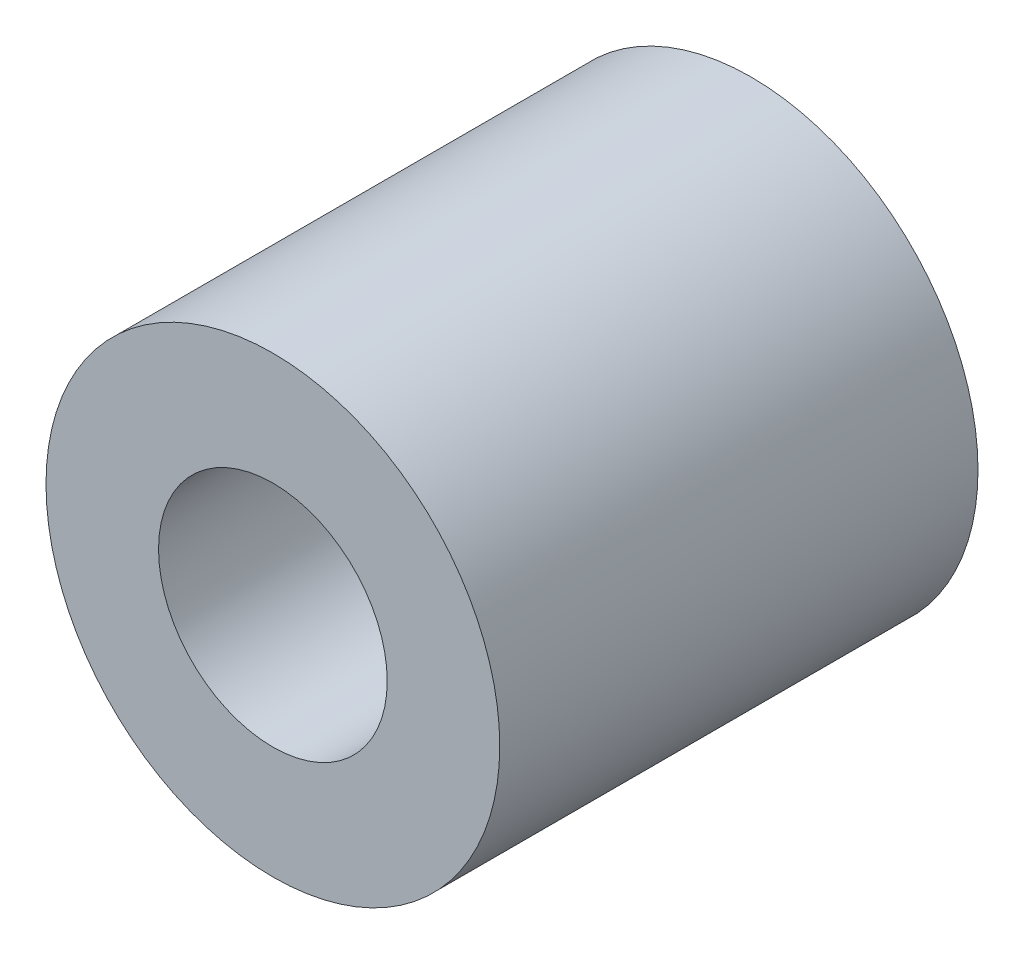
ISO-10303-21;
HEADER;
FILE_DESCRIPTION(('STEP AP214'),'2;1');
FILE_NAME('part.step','',(''),(''),'','','');
FILE_SCHEMA(('AUTOMOTIVE_DESIGN { 1 0 10303 214 1 1 1 1 }'));
ENDSEC;
DATA;
#1=APPLICATION_CONTEXT('core data for automotive mechanical design processes');
#2=APPLICATION_PROTOCOL_DEFINITION('international standard','automotive_design',2000,#1);
#3=PRODUCT_CONTEXT('',#1,'mechanical');
#4=PRODUCT('Part','Part','',(#3));
#5=PRODUCT_RELATED_PRODUCT_CATEGORY('part','',(#4));
#6=PRODUCT_DEFINITION_FORMATION('','',#4);
#7=PRODUCT_DEFINITION_CONTEXT('part definition',#1,'design');
#8=PRODUCT_DEFINITION('design','',#6,#7);
#9=PRODUCT_DEFINITION_SHAPE('','',#8);
#10=(LENGTH_UNIT() NAMED_UNIT(*) SI_UNIT(.MILLI.,.METRE.));
#11=(NAMED_UNIT(*) PLANE_ANGLE_UNIT() SI_UNIT($,.RADIAN.));
#12=(NAMED_UNIT(*) SI_UNIT($,.STERADIAN.) SOLID_ANGLE_UNIT());
#13=UNCERTAINTY_MEASURE_WITH_UNIT(LENGTH_MEASURE(1.E-05),#10,'distance_accuracy_value','');
#14=(GEOMETRIC_REPRESENTATION_CONTEXT(3) GLOBAL_UNCERTAINTY_ASSIGNED_CONTEXT((#13)) GLOBAL_UNIT_ASSIGNED_CONTEXT((#10,
#11,#12)) REPRESENTATION_CONTEXT('',''));
#15=CARTESIAN_POINT('',(0.,0.,0.));
#16=DIRECTION('',(0.,0.,1.));
#17=DIRECTION('',(1.,0.,0.));
#18=AXIS2_PLACEMENT_3D('',#15,#16,#17);
#19=CARTESIAN_POINT('',(0.,0.,6.6929));
#20=DIRECTION('',(0.,0.,1.));
#21=DIRECTION('',(1.,0.,0.));
#22=AXIS2_PLACEMENT_3D('',#19,#20,#21);
#23=PLANE('',#22);
#24=CARTESIAN_POINT('',(0.,0.,6.6929));
#25=DIRECTION('',(0.,0.,1.));
#26=DIRECTION('',(1.,0.,0.));
#27=AXIS2_PLACEMENT_3D('',#24,#25,#26);
#28=CIRCLE('',#27,6.35);
#29=CARTESIAN_POINT('',(6.35,0.,6.6929));
#30=VERTEX_POINT('',#29);
#31=EDGE_CURVE('E10',#30,#30,#28,.T.);
#32=ORIENTED_EDGE('',*,*,#31,.T.);
#33=EDGE_LOOP('',(#32));
#34=FACE_BOUND('',#33,.T.);
#35=CARTESIAN_POINT('',(0.,0.,6.6929));
#36=DIRECTION('',(0.,0.,1.));
#37=DIRECTION('',(1.,0.,0.));
#38=AXIS2_PLACEMENT_3D('',#35,#36,#37);
#39=CIRCLE('',#38,3.2004);
#40=CARTESIAN_POINT('',(3.2004,0.,6.6929));
#41=VERTEX_POINT('',#40);
#42=EDGE_CURVE('E41',#41,#41,#39,.T.);
#43=ORIENTED_EDGE('',*,*,#42,.F.);
#44=EDGE_LOOP('',(#43));
#45=FACE_BOUND('',#44,.T.);
#46=ADVANCED_FACE('F30',(#34,#45),#23,.T.);
#47=CARTESIAN_POINT('',(0.,0.,-6.6929));
#48=DIRECTION('',(0.,0.,1.));
#49=DIRECTION('',(1.,0.,0.));
#50=AXIS2_PLACEMENT_3D('',#47,#48,#49);
#51=PLANE('',#50);
#52=CARTESIAN_POINT('',(0.,0.,-6.6929));
#53=DIRECTION('',(0.,0.,1.));
#54=DIRECTION('',(1.,0.,0.));
#55=AXIS2_PLACEMENT_3D('',#52,#53,#54);
#56=CIRCLE('',#55,6.35);
#57=CARTESIAN_POINT('',(6.35,0.,-6.6929));
#58=VERTEX_POINT('',#57);
#59=EDGE_CURVE('E34',#58,#58,#56,.T.);
#60=ORIENTED_EDGE('',*,*,#59,.F.);
#61=EDGE_LOOP('',(#60));
#62=FACE_BOUND('',#61,.T.);
#63=CARTESIAN_POINT('',(0.,0.,-6.6929));
#64=DIRECTION('',(0.,0.,1.));
#65=DIRECTION('',(1.,0.,0.));
#66=AXIS2_PLACEMENT_3D('',#63,#64,#65);
#67=CIRCLE('',#66,3.2004);
#68=CARTESIAN_POINT('',(3.2004,0.,-6.6929));
#69=VERTEX_POINT('',#68);
#70=EDGE_CURVE('E43',#69,#69,#67,.T.);
#71=ORIENTED_EDGE('',*,*,#70,.T.);
#72=EDGE_LOOP('',(#71));
#73=FACE_BOUND('',#72,.T.);
#74=ADVANCED_FACE('F53',(#62,#73),#51,.F.);
#75=CARTESIAN_POINT('',(0.,0.,6.6929));
#76=DIRECTION('',(0.,0.,-1.));
#77=DIRECTION('',(-1.,0.,0.));
#78=AXIS2_PLACEMENT_3D('',#75,#76,#77);
#79=CYLINDRICAL_SURFACE('',#78,6.35);
#80=ORIENTED_EDGE('',*,*,#31,.F.);
#81=EDGE_LOOP('',(#80));
#82=FACE_BOUND('',#81,.T.);
#83=ORIENTED_EDGE('',*,*,#59,.T.);
#84=EDGE_LOOP('',(#83));
#85=FACE_BOUND('',#84,.T.);
#86=ADVANCED_FACE('F32',(#82,#85),#79,.T.);
#87=CARTESIAN_POINT('',(0.,0.,6.6929));
#88=DIRECTION('',(0.,0.,-1.));
#89=DIRECTION('',(-1.,0.,0.));
#90=AXIS2_PLACEMENT_3D('',#87,#88,#89);
#91=CYLINDRICAL_SURFACE('',#90,3.2004);
#92=ORIENTED_EDGE('',*,*,#42,.T.);
#93=EDGE_LOOP('',(#92));
#94=FACE_BOUND('',#93,.T.);
#95=ORIENTED_EDGE('',*,*,#70,.F.);
#96=EDGE_LOOP('',(#95));
#97=FACE_BOUND('',#96,.T.);
#98=ADVANCED_FACE('F49',(#94,#97),#91,.F.);
#99=CLOSED_SHELL('',(#46,#74,#86,#98));
#100=MANIFOLD_SOLID_BREP('B2',#99);
#101=ADVANCED_BREP_SHAPE_REPRESENTATION('',(#18,#100),#14);
#102=SHAPE_DEFINITION_REPRESENTATION(#9,#101);
ENDSEC;
END-ISO-10303-21;
